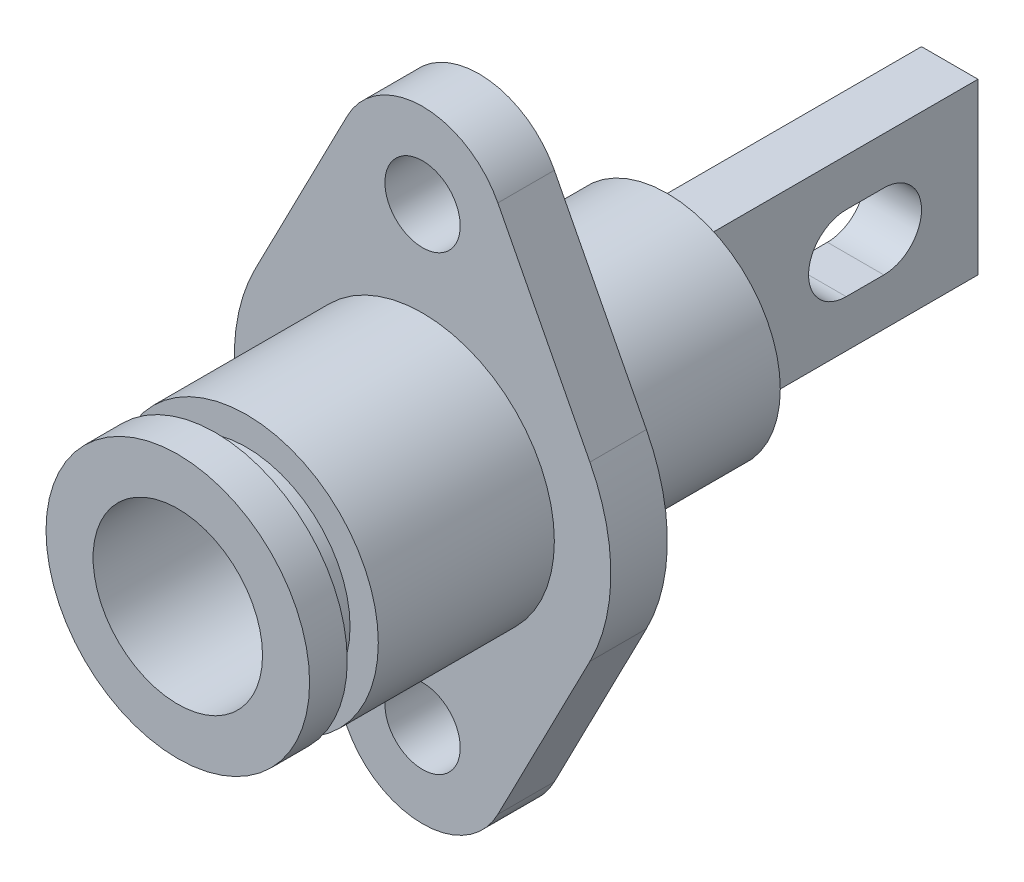
ISO-10303-21;
HEADER;
FILE_DESCRIPTION(('STEP AP214'),'2;1');
FILE_NAME('part.step','',(''),(''),'','','');
FILE_SCHEMA(('AUTOMOTIVE_DESIGN { 1 0 10303 214 1 1 1 1 }'));
ENDSEC;
DATA;
#1=APPLICATION_CONTEXT('core data for automotive mechanical design processes');
#2=APPLICATION_PROTOCOL_DEFINITION('international standard','automotive_design',2000,#1);
#3=PRODUCT_CONTEXT('',#1,'mechanical');
#4=PRODUCT('Part','Part','',(#3));
#5=PRODUCT_RELATED_PRODUCT_CATEGORY('part','',(#4));
#6=PRODUCT_DEFINITION_FORMATION('','',#4);
#7=PRODUCT_DEFINITION_CONTEXT('part definition',#1,'design');
#8=PRODUCT_DEFINITION('design','',#6,#7);
#9=PRODUCT_DEFINITION_SHAPE('','',#8);
#10=(LENGTH_UNIT() NAMED_UNIT(*) SI_UNIT(.MILLI.,.METRE.));
#11=(NAMED_UNIT(*) PLANE_ANGLE_UNIT() SI_UNIT($,.RADIAN.));
#12=(NAMED_UNIT(*) SI_UNIT($,.STERADIAN.) SOLID_ANGLE_UNIT());
#13=UNCERTAINTY_MEASURE_WITH_UNIT(LENGTH_MEASURE(1.E-05),#10,'distance_accuracy_value','');
#14=(GEOMETRIC_REPRESENTATION_CONTEXT(3) GLOBAL_UNCERTAINTY_ASSIGNED_CONTEXT((#13)) GLOBAL_UNIT_ASSIGNED_CONTEXT((#10,
#11,#12)) REPRESENTATION_CONTEXT('',''));
#15=CARTESIAN_POINT('',(0.,0.,0.));
#16=DIRECTION('',(0.,0.,1.));
#17=DIRECTION('',(1.,0.,0.));
#18=AXIS2_PLACEMENT_3D('',#15,#16,#17);
#19=CARTESIAN_POINT('',(1.5,4.5,-25.));
#20=DIRECTION('',(-1.,0.,0.));
#21=DIRECTION('',(0.,-1.,0.));
#22=AXIS2_PLACEMENT_3D('',#19,#20,#21);
#23=PLANE('',#22);
#24=DIRECTION('',(0.,0.,1.));
#25=VECTOR('',#24,1.);
#26=CARTESIAN_POINT('',(1.5,4.5,-25.));
#27=LINE('',#26,#25);
#28=CARTESIAN_POINT('',(1.5,4.5,-25.));
#29=VERTEX_POINT('',#28);
#30=CARTESIAN_POINT('',(1.5,4.5,-10.));
#31=VERTEX_POINT('',#30);
#32=EDGE_CURVE('E243',#29,#31,#27,.T.);
#33=ORIENTED_EDGE('',*,*,#32,.T.);
#34=DIRECTION('',(0.,-1.,0.));
#35=VECTOR('',#34,1.);
#36=CARTESIAN_POINT('',(1.5,4.5,-10.));
#37=LINE('',#36,#35);
#38=CARTESIAN_POINT('',(1.5,-4.5,-10.));
#39=VERTEX_POINT('',#38);
#40=EDGE_CURVE('E217',#31,#39,#37,.T.);
#41=ORIENTED_EDGE('',*,*,#40,.T.);
#42=DIRECTION('',(0.,0.,1.));
#43=VECTOR('',#42,1.);
#44=CARTESIAN_POINT('',(1.5,-4.5,-25.));
#45=LINE('',#44,#43);
#46=CARTESIAN_POINT('',(1.5,-4.5,-25.));
#47=VERTEX_POINT('',#46);
#48=EDGE_CURVE('E240',#47,#39,#45,.T.);
#49=ORIENTED_EDGE('',*,*,#48,.F.);
#50=DIRECTION('',(0.,-1.,0.));
#51=VECTOR('',#50,1.);
#52=CARTESIAN_POINT('',(1.5,4.5,-25.));
#53=LINE('',#52,#51);
#54=EDGE_CURVE('E233',#29,#47,#53,.T.);
#55=ORIENTED_EDGE('',*,*,#54,.F.);
#56=EDGE_LOOP('',(#33,#41,#49,#55));
#57=FACE_BOUND('',#56,.T.);
#58=DIRECTION('',(0.,0.,1.));
#59=VECTOR('',#58,1.);
#60=CARTESIAN_POINT('',(1.5,-2.,-20.));
#61=LINE('',#60,#59);
#62=CARTESIAN_POINT('',(1.5,-2.,-20.));
#63=VERTEX_POINT('',#62);
#64=CARTESIAN_POINT('',(1.5,-2.,-18.));
#65=VERTEX_POINT('',#64);
#66=EDGE_CURVE('E65',#63,#65,#61,.T.);
#67=ORIENTED_EDGE('',*,*,#66,.T.);
#68=CARTESIAN_POINT('',(1.5,0.,-18.));
#69=DIRECTION('',(1.,0.,0.));
#70=DIRECTION('',(0.,1.,0.));
#71=AXIS2_PLACEMENT_3D('',#68,#69,#70);
#72=CIRCLE('',#71,2.);
#73=CARTESIAN_POINT('',(1.5,2.,-18.));
#74=VERTEX_POINT('',#73);
#75=EDGE_CURVE('E178',#74,#65,#72,.T.);
#76=ORIENTED_EDGE('',*,*,#75,.F.);
#77=DIRECTION('',(0.,0.,1.));
#78=VECTOR('',#77,1.);
#79=CARTESIAN_POINT('',(1.5,2.,-20.));
#80=LINE('',#79,#78);
#81=CARTESIAN_POINT('',(1.5,2.,-20.));
#82=VERTEX_POINT('',#81);
#83=EDGE_CURVE('E190',#82,#74,#80,.T.);
#84=ORIENTED_EDGE('',*,*,#83,.F.);
#85=CARTESIAN_POINT('',(1.5,0.,-20.));
#86=DIRECTION('',(1.,0.,0.));
#87=DIRECTION('',(0.,1.,0.));
#88=AXIS2_PLACEMENT_3D('',#85,#86,#87);
#89=CIRCLE('',#88,2.);
#90=EDGE_CURVE('E172',#63,#82,#89,.T.);
#91=ORIENTED_EDGE('',*,*,#90,.F.);
#92=EDGE_LOOP('',(#67,#76,#84,#91));
#93=FACE_BOUND('',#92,.T.);
#94=ADVANCED_FACE('F49',(#57,#93),#23,.F.);
#95=CARTESIAN_POINT('',(-1.5,4.5,-25.));
#96=DIRECTION('',(1.,0.,0.));
#97=DIRECTION('',(0.,1.,0.));
#98=AXIS2_PLACEMENT_3D('',#95,#96,#97);
#99=PLANE('',#98);
#100=DIRECTION('',(0.,0.,1.));
#101=VECTOR('',#100,1.);
#102=CARTESIAN_POINT('',(-1.5,-4.5,-25.));
#103=LINE('',#102,#101);
#104=CARTESIAN_POINT('',(-1.5,-4.5,-25.));
#105=VERTEX_POINT('',#104);
#106=CARTESIAN_POINT('',(-1.5,-4.5,-10.));
#107=VERTEX_POINT('',#106);
#108=EDGE_CURVE('E237',#105,#107,#103,.T.);
#109=ORIENTED_EDGE('',*,*,#108,.T.);
#110=DIRECTION('',(0.,1.,0.));
#111=VECTOR('',#110,1.);
#112=CARTESIAN_POINT('',(-1.5,4.5,-10.));
#113=LINE('',#112,#111);
#114=CARTESIAN_POINT('',(-1.5,4.5,-10.));
#115=VERTEX_POINT('',#114);
#116=EDGE_CURVE('E225',#107,#115,#113,.T.);
#117=ORIENTED_EDGE('',*,*,#116,.T.);
#118=DIRECTION('',(0.,0.,1.));
#119=VECTOR('',#118,1.);
#120=CARTESIAN_POINT('',(-1.5,4.5,-25.));
#121=LINE('',#120,#119);
#122=CARTESIAN_POINT('',(-1.5,4.5,-25.));
#123=VERTEX_POINT('',#122);
#124=EDGE_CURVE('E246',#123,#115,#121,.T.);
#125=ORIENTED_EDGE('',*,*,#124,.F.);
#126=DIRECTION('',(0.,1.,0.));
#127=VECTOR('',#126,1.);
#128=CARTESIAN_POINT('',(-1.5,4.5,-25.));
#129=LINE('',#128,#127);
#130=EDGE_CURVE('E228',#105,#123,#129,.T.);
#131=ORIENTED_EDGE('',*,*,#130,.F.);
#132=EDGE_LOOP('',(#109,#117,#125,#131));
#133=FACE_BOUND('',#132,.T.);
#134=DIRECTION('',(0.,0.,1.));
#135=VECTOR('',#134,1.);
#136=CARTESIAN_POINT('',(-1.5,-2.,-20.));
#137=LINE('',#136,#135);
#138=CARTESIAN_POINT('',(-1.5,-2.,-20.));
#139=VERTEX_POINT('',#138);
#140=CARTESIAN_POINT('',(-1.5,-2.,-18.));
#141=VERTEX_POINT('',#140);
#142=EDGE_CURVE('E161',#139,#141,#137,.T.);
#143=ORIENTED_EDGE('',*,*,#142,.F.);
#144=CARTESIAN_POINT('',(-1.5,0.,-20.));
#145=DIRECTION('',(1.,0.,0.));
#146=DIRECTION('',(0.,1.,0.));
#147=AXIS2_PLACEMENT_3D('',#144,#145,#146);
#148=CIRCLE('',#147,2.);
#149=CARTESIAN_POINT('',(-1.5,2.,-20.));
#150=VERTEX_POINT('',#149);
#151=EDGE_CURVE('E184',#139,#150,#148,.T.);
#152=ORIENTED_EDGE('',*,*,#151,.T.);
#153=DIRECTION('',(0.,0.,1.));
#154=VECTOR('',#153,1.);
#155=CARTESIAN_POINT('',(-1.5,2.,-20.));
#156=LINE('',#155,#154);
#157=CARTESIAN_POINT('',(-1.5,2.,-18.));
#158=VERTEX_POINT('',#157);
#159=EDGE_CURVE('E73',#150,#158,#156,.T.);
#160=ORIENTED_EDGE('',*,*,#159,.T.);
#161=CARTESIAN_POINT('',(-1.5,0.,-18.));
#162=DIRECTION('',(1.,0.,0.));
#163=DIRECTION('',(0.,1.,0.));
#164=AXIS2_PLACEMENT_3D('',#161,#162,#163);
#165=CIRCLE('',#164,2.);
#166=EDGE_CURVE('E171',#158,#141,#165,.T.);
#167=ORIENTED_EDGE('',*,*,#166,.T.);
#168=EDGE_LOOP('',(#143,#152,#160,#167));
#169=FACE_BOUND('',#168,.T.);
#170=ADVANCED_FACE('F182',(#133,#169),#99,.F.);
#171=CARTESIAN_POINT('',(-8.88780375320897,4.58333333333333,3.));
#172=DIRECTION('',(0.888780375320897,-0.458333333333333,0.));
#173=DIRECTION('',(0.458333333333334,0.888780375320897,0.));
#174=AXIS2_PLACEMENT_3D('',#171,#172,#173);
#175=PLANE('',#174);
#176=DIRECTION('',(-0.458333333333334,-0.888780375320897,0.));
#177=VECTOR('',#176,1.);
#178=CARTESIAN_POINT('',(-8.88780375320897,4.58333333333333,0.));
#179=LINE('',#178,#177);
#180=CARTESIAN_POINT('',(-3.99951168894404,14.0625,0.));
#181=VERTEX_POINT('',#180);
#182=CARTESIAN_POINT('',(-8.88780375320897,4.58333333333334,0.));
#183=VERTEX_POINT('',#182);
#184=EDGE_CURVE('E288',#181,#183,#179,.T.);
#185=ORIENTED_EDGE('',*,*,#184,.T.);
#186=DIRECTION('',(0.,0.,-1.));
#187=VECTOR('',#186,1.);
#188=CARTESIAN_POINT('',(-8.88780375320897,4.58333333333334,3.));
#189=LINE('',#188,#187);
#190=CARTESIAN_POINT('',(-8.88780375320897,4.58333333333334,3.));
#191=VERTEX_POINT('',#190);
#192=EDGE_CURVE('E325',#191,#183,#189,.T.);
#193=ORIENTED_EDGE('',*,*,#192,.F.);
#194=DIRECTION('',(-0.458333333333334,-0.888780375320897,0.));
#195=VECTOR('',#194,1.);
#196=CARTESIAN_POINT('',(-8.88780375320897,4.58333333333333,3.));
#197=LINE('',#196,#195);
#198=CARTESIAN_POINT('',(-3.99951168894404,14.0625,3.));
#199=VERTEX_POINT('',#198);
#200=EDGE_CURVE('E262',#199,#191,#197,.T.);
#201=ORIENTED_EDGE('',*,*,#200,.F.);
#202=DIRECTION('',(0.,0.,-1.));
#203=VECTOR('',#202,1.);
#204=CARTESIAN_POINT('',(-3.99951168894404,14.0625,3.));
#205=LINE('',#204,#203);
#206=EDGE_CURVE('E285',#199,#181,#205,.T.);
#207=ORIENTED_EDGE('',*,*,#206,.T.);
#208=EDGE_LOOP('',(#185,#193,#201,#207));
#209=FACE_BOUND('',#208,.T.);
#210=ADVANCED_FACE('F368',(#209),#175,.F.);
#211=CARTESIAN_POINT('',(0.,0.,3.));
#212=DIRECTION('',(0.,0.,-1.));
#213=DIRECTION('',(-1.,0.,0.));
#214=AXIS2_PLACEMENT_3D('',#211,#212,#213);
#215=CYLINDRICAL_SURFACE('',#214,10.);
#216=CARTESIAN_POINT('',(0.,0.,0.));
#217=DIRECTION('',(0.,0.,1.));
#218=DIRECTION('',(1.,0.,0.));
#219=AXIS2_PLACEMENT_3D('',#216,#217,#218);
#220=CIRCLE('',#219,10.);
#221=CARTESIAN_POINT('',(-8.88780375320897,-4.58333333333335,0.));
#222=VERTEX_POINT('',#221);
#223=EDGE_CURVE('E291',#183,#222,#220,.T.);
#224=ORIENTED_EDGE('',*,*,#223,.T.);
#225=DIRECTION('',(0.,0.,-1.));
#226=VECTOR('',#225,1.);
#227=CARTESIAN_POINT('',(-8.88780375320897,-4.58333333333335,3.));
#228=LINE('',#227,#226);
#229=CARTESIAN_POINT('',(-8.88780375320897,-4.58333333333335,3.));
#230=VERTEX_POINT('',#229);
#231=EDGE_CURVE('E323',#230,#222,#228,.T.);
#232=ORIENTED_EDGE('',*,*,#231,.F.);
#233=CARTESIAN_POINT('',(0.,0.,3.));
#234=DIRECTION('',(0.,0.,1.));
#235=DIRECTION('',(1.,0.,0.));
#236=AXIS2_PLACEMENT_3D('',#233,#234,#235);
#237=CIRCLE('',#236,10.);
#238=EDGE_CURVE('E266',#191,#230,#237,.T.);
#239=ORIENTED_EDGE('',*,*,#238,.F.);
#240=ORIENTED_EDGE('',*,*,#192,.T.);
#241=EDGE_LOOP('',(#224,#232,#239,#240));
#242=FACE_BOUND('',#241,.T.);
#243=ADVANCED_FACE('F691',(#242),#215,.T.);
#244=CARTESIAN_POINT('',(-8.88780375320897,-4.58333333333334,3.));
#245=DIRECTION('',(-0.888780375320897,-0.458333333333334,0.));
#246=DIRECTION('',(0.458333333333334,-0.888780375320897,0.));
#247=AXIS2_PLACEMENT_3D('',#244,#245,#246);
#248=PLANE('',#247);
#249=DIRECTION('',(-0.458333333333334,0.888780375320897,0.));
#250=VECTOR('',#249,1.);
#251=CARTESIAN_POINT('',(-8.88780375320897,-4.58333333333334,0.));
#252=LINE('',#251,#250);
#253=CARTESIAN_POINT('',(-3.99951168894403,-14.0625,0.));
#254=VERTEX_POINT('',#253);
#255=EDGE_CURVE('E294',#254,#222,#252,.T.);
#256=ORIENTED_EDGE('',*,*,#255,.F.);
#257=DIRECTION('',(0.,0.,-1.));
#258=VECTOR('',#257,1.);
#259=CARTESIAN_POINT('',(-3.99951168894403,-14.0625,3.));
#260=LINE('',#259,#258);
#261=CARTESIAN_POINT('',(-3.99951168894403,-14.0625,3.));
#262=VERTEX_POINT('',#261);
#263=EDGE_CURVE('E321',#262,#254,#260,.T.);
#264=ORIENTED_EDGE('',*,*,#263,.F.);
#265=DIRECTION('',(-0.458333333333334,0.888780375320897,0.));
#266=VECTOR('',#265,1.);
#267=CARTESIAN_POINT('',(-8.88780375320897,-4.58333333333334,3.));
#268=LINE('',#267,#266);
#269=EDGE_CURVE('E268',#262,#230,#268,.T.);
#270=ORIENTED_EDGE('',*,*,#269,.T.);
#271=ORIENTED_EDGE('',*,*,#231,.T.);
#272=EDGE_LOOP('',(#256,#264,#270,#271));
#273=FACE_BOUND('',#272,.T.);
#274=ADVANCED_FACE('F707',(#273),#248,.T.);
#275=CARTESIAN_POINT('',(0.,-12.,3.));
#276=DIRECTION('',(0.,0.,-1.));
#277=DIRECTION('',(-1.,0.,0.));
#278=AXIS2_PLACEMENT_3D('',#275,#276,#277);
#279=CYLINDRICAL_SURFACE('',#278,4.5);
#280=CARTESIAN_POINT('',(0.,-12.,0.));
#281=DIRECTION('',(0.,0.,1.));
#282=DIRECTION('',(1.,0.,0.));
#283=AXIS2_PLACEMENT_3D('',#280,#281,#282);
#284=CIRCLE('',#283,4.5);
#285=CARTESIAN_POINT('',(3.99951168894404,-14.0625,0.));
#286=VERTEX_POINT('',#285);
#287=EDGE_CURVE('E298',#286,#254,#284,.F.);
#288=ORIENTED_EDGE('',*,*,#287,.F.);
#289=DIRECTION('',(0.,0.,-1.));
#290=VECTOR('',#289,1.);
#291=CARTESIAN_POINT('',(3.99951168894404,-14.0625,3.));
#292=LINE('',#291,#290);
#293=CARTESIAN_POINT('',(3.99951168894404,-14.0625,3.));
#294=VERTEX_POINT('',#293);
#295=EDGE_CURVE('E319',#294,#286,#292,.T.);
#296=ORIENTED_EDGE('',*,*,#295,.F.);
#297=CARTESIAN_POINT('',(0.,-12.,3.));
#298=DIRECTION('',(0.,0.,1.));
#299=DIRECTION('',(1.,0.,0.));
#300=AXIS2_PLACEMENT_3D('',#297,#298,#299);
#301=CIRCLE('',#300,4.5);
#302=EDGE_CURVE('E272',#294,#262,#301,.F.);
#303=ORIENTED_EDGE('',*,*,#302,.T.);
#304=ORIENTED_EDGE('',*,*,#263,.T.);
#305=EDGE_LOOP('',(#288,#296,#303,#304));
#306=FACE_BOUND('',#305,.T.);
#307=ADVANCED_FACE('F698',(#306),#279,.T.);
#308=CARTESIAN_POINT('',(8.88780375320898,-4.58333333333334,3.));
#309=DIRECTION('',(-0.888780375320897,0.458333333333334,0.));
#310=DIRECTION('',(-0.458333333333334,-0.888780375320897,0.));
#311=AXIS2_PLACEMENT_3D('',#308,#309,#310);
#312=PLANE('',#311);
#313=DIRECTION('',(0.458333333333334,0.888780375320897,0.));
#314=VECTOR('',#313,1.);
#315=CARTESIAN_POINT('',(8.88780375320898,-4.58333333333334,0.));
#316=LINE('',#315,#314);
#317=CARTESIAN_POINT('',(8.88780375320897,-4.58333333333335,0.));
#318=VERTEX_POINT('',#317);
#319=EDGE_CURVE('E301',#286,#318,#316,.T.);
#320=ORIENTED_EDGE('',*,*,#319,.T.);
#321=DIRECTION('',(0.,0.,-1.));
#322=VECTOR('',#321,1.);
#323=CARTESIAN_POINT('',(8.88780375320897,-4.58333333333335,3.));
#324=LINE('',#323,#322);
#325=CARTESIAN_POINT('',(8.88780375320897,-4.58333333333335,3.));
#326=VERTEX_POINT('',#325);
#327=EDGE_CURVE('E316',#326,#318,#324,.T.);
#328=ORIENTED_EDGE('',*,*,#327,.F.);
#329=DIRECTION('',(0.458333333333334,0.888780375320897,0.));
#330=VECTOR('',#329,1.);
#331=CARTESIAN_POINT('',(8.88780375320898,-4.58333333333334,3.));
#332=LINE('',#331,#330);
#333=EDGE_CURVE('E275',#294,#326,#332,.T.);
#334=ORIENTED_EDGE('',*,*,#333,.F.);
#335=ORIENTED_EDGE('',*,*,#295,.T.);
#336=EDGE_LOOP('',(#320,#328,#334,#335));
#337=FACE_BOUND('',#336,.T.);
#338=ADVANCED_FACE('F688',(#337),#312,.F.);
#339=CARTESIAN_POINT('',(8.88780375320897,4.58333333333334,0.));
#340=VERTEX_POINT('',#339);
#341=EDGE_CURVE('E295',#318,#340,#220,.T.);
#342=ORIENTED_EDGE('',*,*,#341,.T.);
#343=DIRECTION('',(0.,0.,-1.));
#344=VECTOR('',#343,1.);
#345=CARTESIAN_POINT('',(8.88780375320897,4.58333333333334,3.));
#346=LINE('',#345,#344);
#347=CARTESIAN_POINT('',(8.88780375320897,4.58333333333334,3.));
#348=VERTEX_POINT('',#347);
#349=EDGE_CURVE('E314',#348,#340,#346,.T.);
#350=ORIENTED_EDGE('',*,*,#349,.F.);
#351=EDGE_CURVE('E269',#326,#348,#237,.T.);
#352=ORIENTED_EDGE('',*,*,#351,.F.);
#353=ORIENTED_EDGE('',*,*,#327,.T.);
#354=EDGE_LOOP('',(#342,#350,#352,#353));
#355=FACE_BOUND('',#354,.T.);
#356=ADVANCED_FACE('F679',(#355),#215,.T.);
#357=CARTESIAN_POINT('',(8.88780375320897,4.58333333333334,3.));
#358=DIRECTION('',(0.888780375320897,0.458333333333334,0.));
#359=DIRECTION('',(-0.458333333333334,0.888780375320897,0.));
#360=AXIS2_PLACEMENT_3D('',#357,#358,#359);
#361=PLANE('',#360);
#362=DIRECTION('',(0.458333333333334,-0.888780375320897,0.));
#363=VECTOR('',#362,1.);
#364=CARTESIAN_POINT('',(8.88780375320897,4.58333333333334,0.));
#365=LINE('',#364,#363);
#366=CARTESIAN_POINT('',(3.99951168894404,14.0625,0.));
#367=VERTEX_POINT('',#366);
#368=EDGE_CURVE('E303',#367,#340,#365,.T.);
#369=ORIENTED_EDGE('',*,*,#368,.F.);
#370=DIRECTION('',(0.,0.,-1.));
#371=VECTOR('',#370,1.);
#372=CARTESIAN_POINT('',(3.99951168894404,14.0625,3.));
#373=LINE('',#372,#371);
#374=CARTESIAN_POINT('',(3.99951168894404,14.0625,3.));
#375=VERTEX_POINT('',#374);
#376=EDGE_CURVE('E312',#375,#367,#373,.T.);
#377=ORIENTED_EDGE('',*,*,#376,.F.);
#378=DIRECTION('',(0.458333333333334,-0.888780375320897,0.));
#379=VECTOR('',#378,1.);
#380=CARTESIAN_POINT('',(8.88780375320897,4.58333333333334,3.));
#381=LINE('',#380,#379);
#382=EDGE_CURVE('E277',#375,#348,#381,.T.);
#383=ORIENTED_EDGE('',*,*,#382,.T.);
#384=ORIENTED_EDGE('',*,*,#349,.T.);
#385=EDGE_LOOP('',(#369,#377,#383,#384));
#386=FACE_BOUND('',#385,.T.);
#387=ADVANCED_FACE('F670',(#386),#361,.T.);
#388=CARTESIAN_POINT('',(0.,12.,3.));
#389=DIRECTION('',(0.,0.,-1.));
#390=DIRECTION('',(-1.,0.,0.));
#391=AXIS2_PLACEMENT_3D('',#388,#389,#390);
#392=CYLINDRICAL_SURFACE('',#391,4.5);
#393=CARTESIAN_POINT('',(0.,12.,0.));
#394=DIRECTION('',(0.,0.,1.));
#395=DIRECTION('',(1.,0.,0.));
#396=AXIS2_PLACEMENT_3D('',#393,#394,#395);
#397=CIRCLE('',#396,4.5);
#398=EDGE_CURVE('E306',#367,#181,#397,.T.);
#399=ORIENTED_EDGE('',*,*,#398,.T.);
#400=ORIENTED_EDGE('',*,*,#206,.F.);
#401=CARTESIAN_POINT('',(0.,12.,3.));
#402=DIRECTION('',(0.,0.,1.));
#403=DIRECTION('',(1.,0.,0.));
#404=AXIS2_PLACEMENT_3D('',#401,#402,#403);
#405=CIRCLE('',#404,4.5);
#406=EDGE_CURVE('E280',#375,#199,#405,.T.);
#407=ORIENTED_EDGE('',*,*,#406,.F.);
#408=ORIENTED_EDGE('',*,*,#376,.T.);
#409=EDGE_LOOP('',(#399,#400,#407,#408));
#410=FACE_BOUND('',#409,.T.);
#411=ADVANCED_FACE('F662',(#410),#392,.T.);
#412=CARTESIAN_POINT('',(0.,-12.,3.));
#413=DIRECTION('',(0.,0.,-1.));
#414=DIRECTION('',(-1.,0.,0.));
#415=AXIS2_PLACEMENT_3D('',#412,#413,#414);
#416=CYLINDRICAL_SURFACE('',#415,2.);
#417=CARTESIAN_POINT('',(0.,-12.,3.));
#418=DIRECTION('',(0.,0.,1.));
#419=DIRECTION('',(1.,0.,0.));
#420=AXIS2_PLACEMENT_3D('',#417,#418,#419);
#421=CIRCLE('',#420,2.);
#422=CARTESIAN_POINT('',(2.,-12.,3.));
#423=VERTEX_POINT('',#422);
#424=EDGE_CURVE('E259',#423,#423,#421,.T.);
#425=ORIENTED_EDGE('',*,*,#424,.T.);
#426=EDGE_LOOP('',(#425));
#427=FACE_BOUND('',#426,.T.);
#428=CARTESIAN_POINT('',(0.,-12.,0.));
#429=DIRECTION('',(0.,0.,1.));
#430=DIRECTION('',(1.,0.,0.));
#431=AXIS2_PLACEMENT_3D('',#428,#429,#430);
#432=CIRCLE('',#431,2.);
#433=CARTESIAN_POINT('',(2.,-12.,0.));
#434=VERTEX_POINT('',#433);
#435=EDGE_CURVE('E256',#434,#434,#432,.T.);
#436=ORIENTED_EDGE('',*,*,#435,.F.);
#437=EDGE_LOOP('',(#436));
#438=FACE_BOUND('',#437,.T.);
#439=ADVANCED_FACE('F51',(#427,#438),#416,.F.);
#440=CARTESIAN_POINT('',(0.,12.,3.));
#441=DIRECTION('',(0.,0.,-1.));
#442=DIRECTION('',(-1.,0.,0.));
#443=AXIS2_PLACEMENT_3D('',#440,#441,#442);
#444=CYLINDRICAL_SURFACE('',#443,2.);
#445=CARTESIAN_POINT('',(0.,12.,3.));
#446=DIRECTION('',(0.,0.,1.));
#447=DIRECTION('',(1.,0.,0.));
#448=AXIS2_PLACEMENT_3D('',#445,#446,#447);
#449=CIRCLE('',#448,2.);
#450=CARTESIAN_POINT('',(2.,12.,3.));
#451=VERTEX_POINT('',#450);
#452=EDGE_CURVE('E282',#451,#451,#449,.T.);
#453=ORIENTED_EDGE('',*,*,#452,.T.);
#454=EDGE_LOOP('',(#453));
#455=FACE_BOUND('',#454,.T.);
#456=CARTESIAN_POINT('',(0.,12.,0.));
#457=DIRECTION('',(0.,0.,1.));
#458=DIRECTION('',(1.,0.,0.));
#459=AXIS2_PLACEMENT_3D('',#456,#457,#458);
#460=CIRCLE('',#459,2.);
#461=CARTESIAN_POINT('',(2.,12.,0.));
#462=VERTEX_POINT('',#461);
#463=EDGE_CURVE('E263',#462,#462,#460,.T.);
#464=ORIENTED_EDGE('',*,*,#463,.F.);
#465=EDGE_LOOP('',(#464));
#466=FACE_BOUND('',#465,.T.);
#467=ADVANCED_FACE('F642',(#455,#466),#444,.F.);
#468=CARTESIAN_POINT('',(0.,0.,3.));
#469=DIRECTION('',(0.,0.,1.));
#470=DIRECTION('',(1.,0.,0.));
#471=AXIS2_PLACEMENT_3D('',#468,#469,#470);
#472=PLANE('',#471);
#473=CARTESIAN_POINT('',(0.,0.,3.));
#474=DIRECTION('',(0.,0.,1.));
#475=DIRECTION('',(1.,0.,0.));
#476=AXIS2_PLACEMENT_3D('',#473,#474,#475);
#477=CIRCLE('',#476,7.);
#478=CARTESIAN_POINT('',(7.,0.,3.));
#479=VERTEX_POINT('',#478);
#480=EDGE_CURVE('E252',#479,#479,#477,.T.);
#481=ORIENTED_EDGE('',*,*,#480,.F.);
#482=EDGE_LOOP('',(#481));
#483=FACE_BOUND('',#482,.T.);
#484=ORIENTED_EDGE('',*,*,#424,.F.);
#485=EDGE_LOOP('',(#484));
#486=FACE_BOUND('',#485,.T.);
#487=ORIENTED_EDGE('',*,*,#200,.T.);
#488=ORIENTED_EDGE('',*,*,#238,.T.);
#489=ORIENTED_EDGE('',*,*,#269,.F.);
#490=ORIENTED_EDGE('',*,*,#302,.F.);
#491=ORIENTED_EDGE('',*,*,#333,.T.);
#492=ORIENTED_EDGE('',*,*,#351,.T.);
#493=ORIENTED_EDGE('',*,*,#382,.F.);
#494=ORIENTED_EDGE('',*,*,#406,.T.);
#495=EDGE_LOOP('',(#487,#488,#489,#490,#491,#492,#493,#494));
#496=FACE_BOUND('',#495,.T.);
#497=ORIENTED_EDGE('',*,*,#452,.F.);
#498=EDGE_LOOP('',(#497));
#499=FACE_BOUND('',#498,.T.);
#500=ADVANCED_FACE('F609',(#483,#486,#496,#499),#472,.T.);
#501=CARTESIAN_POINT('',(0.,0.,0.));
#502=DIRECTION('',(0.,0.,1.));
#503=DIRECTION('',(1.,0.,0.));
#504=AXIS2_PLACEMENT_3D('',#501,#502,#503);
#505=PLANE('',#504);
#506=CARTESIAN_POINT('',(0.,0.,0.));
#507=DIRECTION('',(0.,0.,1.));
#508=DIRECTION('',(1.,0.,0.));
#509=AXIS2_PLACEMENT_3D('',#506,#507,#508);
#510=CIRCLE('',#509,7.5);
#511=CARTESIAN_POINT('',(7.5,0.,0.));
#512=VERTEX_POINT('',#511);
#513=EDGE_CURVE('E327',#512,#512,#510,.F.);
#514=ORIENTED_EDGE('',*,*,#513,.F.);
#515=EDGE_LOOP('',(#514));
#516=FACE_BOUND('',#515,.T.);
#517=ORIENTED_EDGE('',*,*,#435,.T.);
#518=EDGE_LOOP('',(#517));
#519=FACE_BOUND('',#518,.T.);
#520=ORIENTED_EDGE('',*,*,#184,.F.);
#521=ORIENTED_EDGE('',*,*,#398,.F.);
#522=ORIENTED_EDGE('',*,*,#368,.T.);
#523=ORIENTED_EDGE('',*,*,#341,.F.);
#524=ORIENTED_EDGE('',*,*,#319,.F.);
#525=ORIENTED_EDGE('',*,*,#287,.T.);
#526=ORIENTED_EDGE('',*,*,#255,.T.);
#527=ORIENTED_EDGE('',*,*,#223,.F.);
#528=EDGE_LOOP('',(#520,#521,#522,#523,#524,#525,#526,#527));
#529=FACE_BOUND('',#528,.T.);
#530=ORIENTED_EDGE('',*,*,#463,.T.);
#531=EDGE_LOOP('',(#530));
#532=FACE_BOUND('',#531,.T.);
#533=ADVANCED_FACE('F599',(#516,#519,#529,#532),#505,.F.);
#534=CARTESIAN_POINT('',(0.,0.,12.35));
#535=DIRECTION('',(0.,0.,-1.));
#536=DIRECTION('',(-1.,0.,0.));
#537=AXIS2_PLACEMENT_3D('',#534,#535,#536);
#538=CYLINDRICAL_SURFACE('',#537,7.);
#539=CARTESIAN_POINT('',(0.,0.,12.35));
#540=DIRECTION('',(0.,0.,1.));
#541=DIRECTION('',(1.,0.,0.));
#542=AXIS2_PLACEMENT_3D('',#539,#540,#541);
#543=CIRCLE('',#542,7.);
#544=CARTESIAN_POINT('',(7.,0.,12.35));
#545=VERTEX_POINT('',#544);
#546=EDGE_CURVE('E253',#545,#545,#543,.T.);
#547=ORIENTED_EDGE('',*,*,#546,.F.);
#548=EDGE_LOOP('',(#547));
#549=FACE_BOUND('',#548,.T.);
#550=ORIENTED_EDGE('',*,*,#480,.T.);
#551=EDGE_LOOP('',(#550));
#552=FACE_BOUND('',#551,.T.);
#553=ADVANCED_FACE('F589',(#549,#552),#538,.T.);
#554=CARTESIAN_POINT('',(0.,0.,12.35));
#555=DIRECTION('',(0.,0.,1.));
#556=DIRECTION('',(1.,0.,0.));
#557=AXIS2_PLACEMENT_3D('',#554,#555,#556);
#558=PLANE('',#557);
#559=CARTESIAN_POINT('',(0.,0.,12.35));
#560=DIRECTION('',(0.,0.,1.));
#561=DIRECTION('',(1.,0.,0.));
#562=AXIS2_PLACEMENT_3D('',#559,#560,#561);
#563=CIRCLE('',#562,5.5);
#564=CARTESIAN_POINT('',(5.5,0.,12.35));
#565=VERTEX_POINT('',#564);
#566=EDGE_CURVE('E11',#565,#565,#563,.T.);
#567=ORIENTED_EDGE('',*,*,#566,.F.);
#568=EDGE_LOOP('',(#567));
#569=FACE_BOUND('',#568,.T.);
#570=ORIENTED_EDGE('',*,*,#546,.T.);
#571=EDGE_LOOP('',(#570));
#572=FACE_BOUND('',#571,.T.);
#573=ADVANCED_FACE('F579',(#569,#572),#558,.T.);
#574=CARTESIAN_POINT('',(0.,0.,-0.5));
#575=DIRECTION('',(0.,0.,1.));
#576=DIRECTION('',(1.,0.,0.));
#577=AXIS2_PLACEMENT_3D('',#574,#575,#576);
#578=CYLINDRICAL_SURFACE('',#577,7.5);
#579=CARTESIAN_POINT('',(0.,0.,-0.5));
#580=DIRECTION('',(0.,0.,-1.));
#581=DIRECTION('',(-1.,0.,0.));
#582=AXIS2_PLACEMENT_3D('',#579,#580,#581);
#583=CIRCLE('',#582,7.5);
#584=CARTESIAN_POINT('',(-7.5,0.,-0.5));
#585=VERTEX_POINT('',#584);
#586=EDGE_CURVE('E249',#585,#585,#583,.T.);
#587=ORIENTED_EDGE('',*,*,#586,.F.);
#588=EDGE_LOOP('',(#587));
#589=FACE_BOUND('',#588,.T.);
#590=ORIENTED_EDGE('',*,*,#513,.T.);
#591=EDGE_LOOP('',(#590));
#592=FACE_BOUND('',#591,.T.);
#593=ADVANCED_FACE('F570',(#589,#592),#578,.T.);
#594=CARTESIAN_POINT('',(0.,0.,-0.5));
#595=DIRECTION('',(0.,0.,-1.));
#596=DIRECTION('',(-1.,0.,0.));
#597=AXIS2_PLACEMENT_3D('',#594,#595,#596);
#598=PLANE('',#597);
#599=CARTESIAN_POINT('',(0.,0.,-0.5));
#600=DIRECTION('',(0.,0.,-1.));
#601=DIRECTION('',(-1.,0.,0.));
#602=AXIS2_PLACEMENT_3D('',#599,#600,#601);
#603=CIRCLE('',#602,6.);
#604=CARTESIAN_POINT('',(-6.,0.,-0.5));
#605=VERTEX_POINT('',#604);
#606=EDGE_CURVE('E212',#605,#605,#603,.T.);
#607=ORIENTED_EDGE('',*,*,#606,.F.);
#608=EDGE_LOOP('',(#607));
#609=FACE_BOUND('',#608,.T.);
#610=ORIENTED_EDGE('',*,*,#586,.T.);
#611=EDGE_LOOP('',(#610));
#612=FACE_BOUND('',#611,.T.);
#613=ADVANCED_FACE('F377',(#609,#612),#598,.T.);
#614=CARTESIAN_POINT('',(0.,0.,-10.));
#615=DIRECTION('',(0.,0.,-1.));
#616=DIRECTION('',(-1.,0.,0.));
#617=AXIS2_PLACEMENT_3D('',#614,#615,#616);
#618=PLANE('',#617);
#619=CARTESIAN_POINT('',(0.,0.,-10.));
#620=DIRECTION('',(0.,0.,-1.));
#621=DIRECTION('',(-1.,0.,0.));
#622=AXIS2_PLACEMENT_3D('',#619,#620,#621);
#623=CIRCLE('',#622,6.);
#624=CARTESIAN_POINT('',(-6.,0.,-10.));
#625=VERTEX_POINT('',#624);
#626=EDGE_CURVE('E214',#625,#625,#623,.T.);
#627=ORIENTED_EDGE('',*,*,#626,.T.);
#628=EDGE_LOOP('',(#627));
#629=FACE_BOUND('',#628,.T.);
#630=ORIENTED_EDGE('',*,*,#116,.F.);
#631=DIRECTION('',(-1.,0.,0.));
#632=VECTOR('',#631,1.);
#633=CARTESIAN_POINT('',(1.5,-4.5,-10.));
#634=LINE('',#633,#632);
#635=EDGE_CURVE('E53',#39,#107,#634,.T.);
#636=ORIENTED_EDGE('',*,*,#635,.F.);
#637=ORIENTED_EDGE('',*,*,#40,.F.);
#638=DIRECTION('',(1.,0.,0.));
#639=VECTOR('',#638,1.);
#640=CARTESIAN_POINT('',(1.5,4.5,-10.));
#641=LINE('',#640,#639);
#642=EDGE_CURVE('E222',#115,#31,#641,.T.);
#643=ORIENTED_EDGE('',*,*,#642,.F.);
#644=EDGE_LOOP('',(#630,#636,#637,#643));
#645=FACE_BOUND('',#644,.T.);
#646=ADVANCED_FACE('F347',(#629,#645),#618,.T.);
#647=CARTESIAN_POINT('',(0.,0.,-10.));
#648=DIRECTION('',(0.,0.,1.));
#649=DIRECTION('',(1.,0.,0.));
#650=AXIS2_PLACEMENT_3D('',#647,#648,#649);
#651=CYLINDRICAL_SURFACE('',#650,6.);
#652=ORIENTED_EDGE('',*,*,#626,.F.);
#653=EDGE_LOOP('',(#652));
#654=FACE_BOUND('',#653,.T.);
#655=ORIENTED_EDGE('',*,*,#606,.T.);
#656=EDGE_LOOP('',(#655));
#657=FACE_BOUND('',#656,.T.);
#658=ADVANCED_FACE('F372',(#654,#657),#651,.T.);
#659=CARTESIAN_POINT('',(0.,0.,-25.));
#660=DIRECTION('',(0.,0.,-1.));
#661=DIRECTION('',(-1.,0.,0.));
#662=AXIS2_PLACEMENT_3D('',#659,#660,#661);
#663=PLANE('',#662);
#664=ORIENTED_EDGE('',*,*,#130,.T.);
#665=DIRECTION('',(1.,0.,0.));
#666=VECTOR('',#665,1.);
#667=CARTESIAN_POINT('',(1.5,4.5,-25.));
#668=LINE('',#667,#666);
#669=EDGE_CURVE('E231',#123,#29,#668,.T.);
#670=ORIENTED_EDGE('',*,*,#669,.T.);
#671=ORIENTED_EDGE('',*,*,#54,.T.);
#672=DIRECTION('',(-1.,0.,0.));
#673=VECTOR('',#672,1.);
#674=CARTESIAN_POINT('',(1.5,-4.5,-25.));
#675=LINE('',#674,#673);
#676=EDGE_CURVE('E235',#47,#105,#675,.T.);
#677=ORIENTED_EDGE('',*,*,#676,.T.);
#678=EDGE_LOOP('',(#664,#670,#671,#677));
#679=FACE_BOUND('',#678,.T.);
#680=ADVANCED_FACE('F342',(#679),#663,.T.);
#681=CARTESIAN_POINT('',(1.5,-4.5,-25.));
#682=DIRECTION('',(0.,1.,0.));
#683=DIRECTION('',(0.,0.,1.));
#684=AXIS2_PLACEMENT_3D('',#681,#682,#683);
#685=PLANE('',#684);
#686=ORIENTED_EDGE('',*,*,#48,.T.);
#687=ORIENTED_EDGE('',*,*,#635,.T.);
#688=ORIENTED_EDGE('',*,*,#108,.F.);
#689=ORIENTED_EDGE('',*,*,#676,.F.);
#690=EDGE_LOOP('',(#686,#687,#688,#689));
#691=FACE_BOUND('',#690,.T.);
#692=ADVANCED_FACE('F334',(#691),#685,.F.);
#693=CARTESIAN_POINT('',(1.5,4.5,-25.));
#694=DIRECTION('',(0.,-1.,0.));
#695=DIRECTION('',(0.,0.,-1.));
#696=AXIS2_PLACEMENT_3D('',#693,#694,#695);
#697=PLANE('',#696);
#698=ORIENTED_EDGE('',*,*,#124,.T.);
#699=ORIENTED_EDGE('',*,*,#642,.T.);
#700=ORIENTED_EDGE('',*,*,#32,.F.);
#701=ORIENTED_EDGE('',*,*,#669,.F.);
#702=EDGE_LOOP('',(#698,#699,#700,#701));
#703=FACE_BOUND('',#702,.T.);
#704=ADVANCED_FACE('F349',(#703),#697,.F.);
#705=CARTESIAN_POINT('',(0.,0.,14.));
#706=DIRECTION('',(0.,0.,-1.));
#707=DIRECTION('',(-1.,0.,0.));
#708=AXIS2_PLACEMENT_3D('',#705,#706,#707);
#709=CYLINDRICAL_SURFACE('',#708,5.5);
#710=CARTESIAN_POINT('',(0.,0.,14.));
#711=DIRECTION('',(0.,0.,1.));
#712=DIRECTION('',(1.,0.,0.));
#713=AXIS2_PLACEMENT_3D('',#710,#711,#712);
#714=CIRCLE('',#713,5.5);
#715=CARTESIAN_POINT('',(5.5,0.,14.));
#716=VERTEX_POINT('',#715);
#717=EDGE_CURVE('E208',#716,#716,#714,.T.);
#718=ORIENTED_EDGE('',*,*,#717,.F.);
#719=EDGE_LOOP('',(#718));
#720=FACE_BOUND('',#719,.T.);
#721=ORIENTED_EDGE('',*,*,#566,.T.);
#722=EDGE_LOOP('',(#721));
#723=FACE_BOUND('',#722,.T.);
#724=ADVANCED_FACE('F351',(#720,#723),#709,.T.);
#725=CARTESIAN_POINT('',(0.,0.,16.));
#726=DIRECTION('',(0.,0.,-1.));
#727=DIRECTION('',(-1.,0.,0.));
#728=AXIS2_PLACEMENT_3D('',#725,#726,#727);
#729=CYLINDRICAL_SURFACE('',#728,7.);
#730=CARTESIAN_POINT('',(0.,0.,16.));
#731=DIRECTION('',(0.,0.,1.));
#732=DIRECTION('',(1.,0.,0.));
#733=AXIS2_PLACEMENT_3D('',#730,#731,#732);
#734=CIRCLE('',#733,7.);
#735=CARTESIAN_POINT('',(7.,0.,16.));
#736=VERTEX_POINT('',#735);
#737=EDGE_CURVE('E205',#736,#736,#734,.T.);
#738=ORIENTED_EDGE('',*,*,#737,.F.);
#739=EDGE_LOOP('',(#738));
#740=FACE_BOUND('',#739,.T.);
#741=CARTESIAN_POINT('',(0.,0.,14.));
#742=DIRECTION('',(0.,0.,1.));
#743=DIRECTION('',(1.,0.,0.));
#744=AXIS2_PLACEMENT_3D('',#741,#742,#743);
#745=CIRCLE('',#744,7.);
#746=CARTESIAN_POINT('',(7.,0.,14.));
#747=VERTEX_POINT('',#746);
#748=EDGE_CURVE('E202',#747,#747,#745,.T.);
#749=ORIENTED_EDGE('',*,*,#748,.T.);
#750=EDGE_LOOP('',(#749));
#751=FACE_BOUND('',#750,.T.);
#752=ADVANCED_FACE('F358',(#740,#751),#729,.T.);
#753=CARTESIAN_POINT('',(0.,0.,16.));
#754=DIRECTION('',(0.,0.,1.));
#755=DIRECTION('',(1.,0.,0.));
#756=AXIS2_PLACEMENT_3D('',#753,#754,#755);
#757=PLANE('',#756);
#758=CARTESIAN_POINT('',(0.,0.,16.));
#759=DIRECTION('',(0.,0.,1.));
#760=DIRECTION('',(1.,0.,0.));
#761=AXIS2_PLACEMENT_3D('',#758,#759,#760);
#762=CIRCLE('',#761,4.5);
#763=CARTESIAN_POINT('',(4.5,0.,16.));
#764=VERTEX_POINT('',#763);
#765=EDGE_CURVE('E179',#764,#764,#762,.T.);
#766=ORIENTED_EDGE('',*,*,#765,.F.);
#767=EDGE_LOOP('',(#766));
#768=FACE_BOUND('',#767,.T.);
#769=ORIENTED_EDGE('',*,*,#737,.T.);
#770=EDGE_LOOP('',(#769));
#771=FACE_BOUND('',#770,.T.);
#772=ADVANCED_FACE('F382',(#768,#771),#757,.T.);
#773=CARTESIAN_POINT('',(0.,0.,14.));
#774=DIRECTION('',(0.,0.,1.));
#775=DIRECTION('',(1.,0.,0.));
#776=AXIS2_PLACEMENT_3D('',#773,#774,#775);
#777=PLANE('',#776);
#778=ORIENTED_EDGE('',*,*,#717,.T.);
#779=EDGE_LOOP('',(#778));
#780=FACE_BOUND('',#779,.T.);
#781=ORIENTED_EDGE('',*,*,#748,.F.);
#782=EDGE_LOOP('',(#781));
#783=FACE_BOUND('',#782,.T.);
#784=ADVANCED_FACE('F384',(#780,#783),#777,.F.);
#785=CARTESIAN_POINT('',(0.,0.,-9.00000000000001));
#786=DIRECTION('',(0.,0.,1.));
#787=DIRECTION('',(1.,0.,0.));
#788=AXIS2_PLACEMENT_3D('',#785,#786,#787);
#789=CYLINDRICAL_SURFACE('',#788,4.5);
#790=CARTESIAN_POINT('',(0.,0.,-9.00000000000001));
#791=DIRECTION('',(0.,0.,1.));
#792=DIRECTION('',(1.,0.,0.));
#793=AXIS2_PLACEMENT_3D('',#790,#791,#792);
#794=CIRCLE('',#793,4.5);
#795=CARTESIAN_POINT('',(4.5,0.,-9.00000000000001));
#796=VERTEX_POINT('',#795);
#797=EDGE_CURVE('E199',#796,#796,#794,.T.);
#798=CARTESIAN_POINT('',(4.5,0.,-9.00000000000001));
#799=CARTESIAN_POINT('',(4.5,0.,-8.73958333333335));
#800=CARTESIAN_POINT('',(4.5,0.,-8.47916666666668));
#801=CARTESIAN_POINT('',(4.5,0.,-7.95833333333334));
#802=CARTESIAN_POINT('',(4.5,0.,-7.69791666666668));
#803=CARTESIAN_POINT('',(4.5,0.,-7.17708333333335));
#804=CARTESIAN_POINT('',(4.5,0.,-6.91666666666668));
#805=CARTESIAN_POINT('',(4.5,0.,-6.39583333333334));
#806=CARTESIAN_POINT('',(4.5,0.,-6.13541666666668));
#807=CARTESIAN_POINT('',(4.5,0.,-5.61458333333334));
#808=CARTESIAN_POINT('',(4.5,0.,-5.35416666666668));
#809=CARTESIAN_POINT('',(4.5,0.,-4.83333333333334));
#810=CARTESIAN_POINT('',(4.5,0.,-4.57291666666668));
#811=CARTESIAN_POINT('',(4.5,0.,-4.05208333333334));
#812=CARTESIAN_POINT('',(4.5,0.,-3.79166666666668));
#813=CARTESIAN_POINT('',(4.5,0.,-3.27083333333334));
#814=CARTESIAN_POINT('',(4.5,0.,-3.01041666666668));
#815=CARTESIAN_POINT('',(4.5,0.,-2.48958333333334));
#816=CARTESIAN_POINT('',(4.5,0.,-2.22916666666668));
#817=CARTESIAN_POINT('',(4.5,0.,-1.70833333333334));
#818=CARTESIAN_POINT('',(4.5,0.,-1.44791666666667));
#819=CARTESIAN_POINT('',(4.5,0.,-0.927083333333341));
#820=CARTESIAN_POINT('',(4.5,0.,-0.666666666666674));
#821=CARTESIAN_POINT('',(4.5,0.,-0.145833333333341));
#822=CARTESIAN_POINT('',(4.5,0.,0.114583333333325));
#823=CARTESIAN_POINT('',(4.5,0.,0.635416666666659));
#824=CARTESIAN_POINT('',(4.5,0.,0.895833333333325));
#825=CARTESIAN_POINT('',(4.5,0.,1.41666666666666));
#826=CARTESIAN_POINT('',(4.5,0.,1.67708333333333));
#827=CARTESIAN_POINT('',(4.5,0.,2.19791666666666));
#828=CARTESIAN_POINT('',(4.5,0.,2.45833333333333));
#829=CARTESIAN_POINT('',(4.5,0.,2.97916666666666));
#830=CARTESIAN_POINT('',(4.5,0.,3.23958333333333));
#831=CARTESIAN_POINT('',(4.5,0.,3.76041666666666));
#832=CARTESIAN_POINT('',(4.5,0.,4.02083333333333));
#833=CARTESIAN_POINT('',(4.5,0.,4.54166666666666));
#834=CARTESIAN_POINT('',(4.5,0.,4.80208333333333));
#835=CARTESIAN_POINT('',(4.5,0.,5.32291666666666));
#836=CARTESIAN_POINT('',(4.5,0.,5.58333333333333));
#837=CARTESIAN_POINT('',(4.5,0.,6.10416666666666));
#838=CARTESIAN_POINT('',(4.5,0.,6.36458333333333));
#839=CARTESIAN_POINT('',(4.5,0.,6.88541666666666));
#840=CARTESIAN_POINT('',(4.5,0.,7.14583333333333));
#841=CARTESIAN_POINT('',(4.5,0.,7.66666666666666));
#842=CARTESIAN_POINT('',(4.5,0.,7.92708333333333));
#843=CARTESIAN_POINT('',(4.5,0.,8.44791666666666));
#844=CARTESIAN_POINT('',(4.5,0.,8.70833333333333));
#845=CARTESIAN_POINT('',(4.5,0.,9.22916666666666));
#846=CARTESIAN_POINT('',(4.5,0.,9.48958333333333));
#847=CARTESIAN_POINT('',(4.5,0.,10.0104166666667));
#848=CARTESIAN_POINT('',(4.5,0.,10.2708333333333));
#849=CARTESIAN_POINT('',(4.5,0.,10.7916666666667));
#850=CARTESIAN_POINT('',(4.5,0.,11.0520833333333));
#851=CARTESIAN_POINT('',(4.5,0.,11.5729166666667));
#852=CARTESIAN_POINT('',(4.5,0.,11.8333333333333));
#853=CARTESIAN_POINT('',(4.5,0.,12.3541666666667));
#854=CARTESIAN_POINT('',(4.5,0.,12.6145833333333));
#855=CARTESIAN_POINT('',(4.5,0.,13.1354166666667));
#856=CARTESIAN_POINT('',(4.5,0.,13.3958333333333));
#857=CARTESIAN_POINT('',(4.5,0.,13.9166666666667));
#858=CARTESIAN_POINT('',(4.5,0.,14.1770833333333));
#859=CARTESIAN_POINT('',(4.5,0.,14.6979166666667));
#860=CARTESIAN_POINT('',(4.5,0.,14.9583333333333));
#861=CARTESIAN_POINT('',(4.5,0.,15.4791666666667));
#862=CARTESIAN_POINT('',(4.5,0.,15.7395833333333));
#863=CARTESIAN_POINT('',(4.5,0.,16.));
#864=B_SPLINE_CURVE_WITH_KNOTS('',3,(#798,#799,#800,#801,#802,#803,#804,#805,#806,#807,#808,
#809,#810,#811,#812,#813,#814,#815,#816,#817,#818,#819,#820,#821,#822,#823,#824,#825,#826,#827,
#828,#829,#830,#831,#832,#833,#834,#835,#836,#837,#838,#839,#840,#841,#842,#843,#844,#845,#846,
#847,#848,#849,#850,#851,#852,#853,#854,#855,#856,#857,#858,#859,#860,#861,#862,#863),
.UNSPECIFIED.,.F.,.F.,(4,2,2,2,2,2,2,2,2,2,2,2,2,2,2,2,2,2,2,2,2,2,2,2,2,2,2,2,2,2,2,2,4),(0.,
0.781249999999999,1.5625,2.34375,3.125,3.90625,4.6875,5.46875,6.25,7.03125,7.8125,8.59375,9.375,
10.15625,10.9375,11.71875,12.5,13.28125,14.0625,14.84375,15.625,16.40625,17.1875,17.96875,18.75,
19.53125,20.3125,21.09375,21.875,22.65625,23.4375,24.21875,25.),.UNSPECIFIED.);
#865=EDGE_CURVE('BSEAM387',#796,#764,#864,.T.);
#866=ORIENTED_EDGE('',*,*,#797,.F.);
#867=ORIENTED_EDGE('',*,*,#765,.T.);
#868=ORIENTED_EDGE('',*,*,#865,.T.);
#869=ORIENTED_EDGE('',*,*,#865,.F.);
#870=EDGE_LOOP('',(#866,#868,#867,#869));
#871=FACE_BOUND('',#870,.T.);
#872=ADVANCED_FACE('F387',(#871),#789,.F.);
#873=CARTESIAN_POINT('',(0.,0.,-9.00000000000001));
#874=DIRECTION('',(0.,0.,1.));
#875=DIRECTION('',(1.,0.,0.));
#876=AXIS2_PLACEMENT_3D('',#873,#874,#875);
#877=PLANE('',#876);
#878=ORIENTED_EDGE('',*,*,#797,.T.);
#879=EDGE_LOOP('',(#878));
#880=FACE_BOUND('',#879,.T.);
#881=ADVANCED_FACE('F394',(#880),#877,.T.);
#882=CARTESIAN_POINT('',(-1.5,-2.,-20.));
#883=DIRECTION('',(0.,1.,0.));
#884=DIRECTION('',(-1.,0.,0.));
#885=AXIS2_PLACEMENT_3D('',#882,#883,#884);
#886=PLANE('',#885);
#887=ORIENTED_EDGE('',*,*,#66,.F.);
#888=DIRECTION('',(1.,0.,0.));
#889=VECTOR('',#888,1.);
#890=CARTESIAN_POINT('',(-1.5,-2.,-20.));
#891=LINE('',#890,#889);
#892=EDGE_CURVE('E166',#139,#63,#891,.T.);
#893=ORIENTED_EDGE('',*,*,#892,.F.);
#894=ORIENTED_EDGE('',*,*,#142,.T.);
#895=DIRECTION('',(1.,0.,0.));
#896=VECTOR('',#895,1.);
#897=CARTESIAN_POINT('',(-1.5,-2.,-18.));
#898=LINE('',#897,#896);
#899=EDGE_CURVE('E164',#141,#65,#898,.T.);
#900=ORIENTED_EDGE('',*,*,#899,.T.);
#901=EDGE_LOOP('',(#887,#893,#894,#900));
#902=FACE_BOUND('',#901,.T.);
#903=ADVANCED_FACE('F163',(#902),#886,.T.);
#904=CARTESIAN_POINT('',(-1.5,0.,-18.));
#905=DIRECTION('',(1.,0.,0.));
#906=DIRECTION('',(0.,1.,0.));
#907=AXIS2_PLACEMENT_3D('',#904,#905,#906);
#908=CYLINDRICAL_SURFACE('',#907,2.);
#909=ORIENTED_EDGE('',*,*,#75,.T.);
#910=ORIENTED_EDGE('',*,*,#899,.F.);
#911=ORIENTED_EDGE('',*,*,#166,.F.);
#912=DIRECTION('',(1.,0.,0.));
#913=VECTOR('',#912,1.);
#914=CARTESIAN_POINT('',(-1.5,2.,-18.));
#915=LINE('',#914,#913);
#916=EDGE_CURVE('E180',#158,#74,#915,.T.);
#917=ORIENTED_EDGE('',*,*,#916,.T.);
#918=EDGE_LOOP('',(#909,#910,#911,#917));
#919=FACE_BOUND('',#918,.T.);
#920=ADVANCED_FACE('F176',(#919),#908,.F.);
#921=CARTESIAN_POINT('',(-1.5,2.,-20.));
#922=DIRECTION('',(0.,1.,0.));
#923=DIRECTION('',(0.,0.,1.));
#924=AXIS2_PLACEMENT_3D('',#921,#922,#923);
#925=PLANE('',#924);
#926=ORIENTED_EDGE('',*,*,#83,.T.);
#927=ORIENTED_EDGE('',*,*,#916,.F.);
#928=ORIENTED_EDGE('',*,*,#159,.F.);
#929=DIRECTION('',(1.,0.,0.));
#930=VECTOR('',#929,1.);
#931=CARTESIAN_POINT('',(-1.5,2.,-20.));
#932=LINE('',#931,#930);
#933=EDGE_CURVE('E196',#150,#82,#932,.T.);
#934=ORIENTED_EDGE('',*,*,#933,.T.);
#935=EDGE_LOOP('',(#926,#927,#928,#934));
#936=FACE_BOUND('',#935,.T.);
#937=ADVANCED_FACE('F402',(#936),#925,.F.);
#938=CARTESIAN_POINT('',(-1.5,0.,-20.));
#939=DIRECTION('',(1.,0.,0.));
#940=DIRECTION('',(0.,1.,0.));
#941=AXIS2_PLACEMENT_3D('',#938,#939,#940);
#942=CYLINDRICAL_SURFACE('',#941,2.);
#943=ORIENTED_EDGE('',*,*,#90,.T.);
#944=ORIENTED_EDGE('',*,*,#933,.F.);
#945=ORIENTED_EDGE('',*,*,#151,.F.);
#946=ORIENTED_EDGE('',*,*,#892,.T.);
#947=EDGE_LOOP('',(#943,#944,#945,#946));
#948=FACE_BOUND('',#947,.T.);
#949=ADVANCED_FACE('F405',(#948),#942,.F.);
#950=CLOSED_SHELL('',(#94,#170,#210,#243,#274,#307,#338,#356,#387,#411,#439,#467,#500,#533,#553,
#573,#593,#613,#646,#658,#680,#692,#704,#724,#752,#772,#784,#872,#881,#903,#920,#937,#949));
#951=MANIFOLD_SOLID_BREP('B2',#950);
#952=ADVANCED_BREP_SHAPE_REPRESENTATION('',(#18,#951),#14);
#953=SHAPE_DEFINITION_REPRESENTATION(#9,#952);
ENDSEC;
END-ISO-10303-21;
